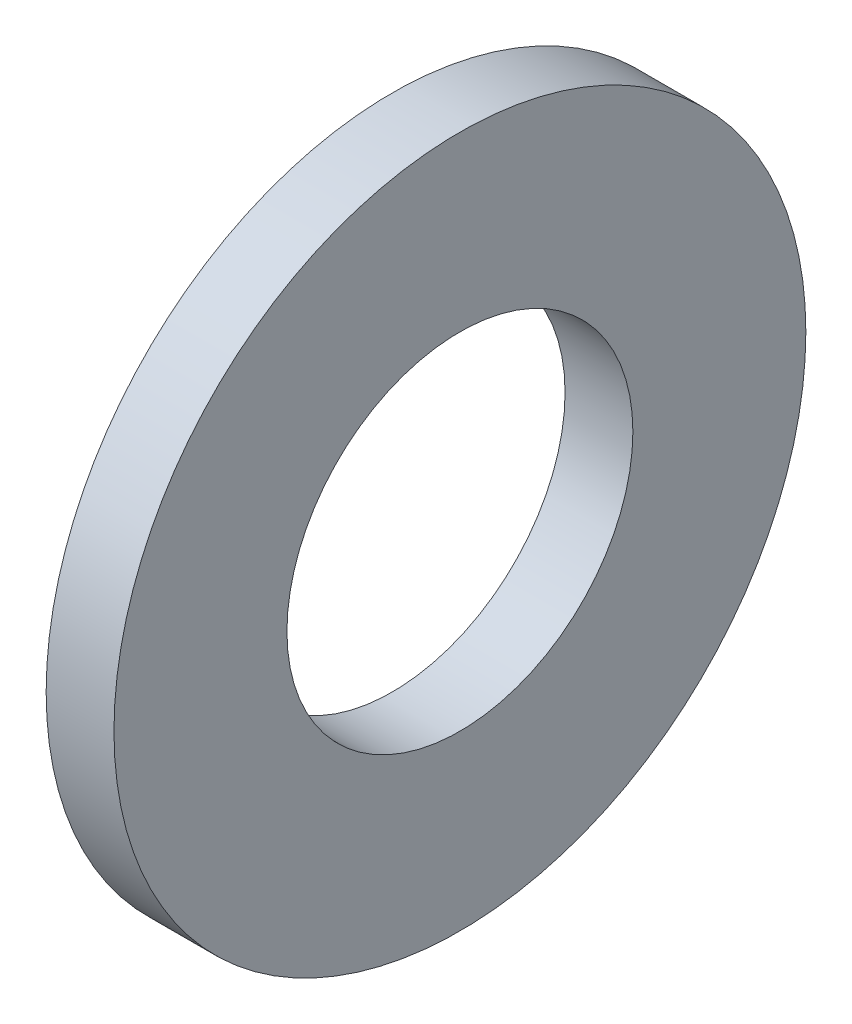
ISO-10303-21;
HEADER;
FILE_DESCRIPTION(('STEP AP214'),'2;1');
FILE_NAME('part.step','',(''),(''),'','','');
FILE_SCHEMA(('AUTOMOTIVE_DESIGN { 1 0 10303 214 1 1 1 1 }'));
ENDSEC;
DATA;
#1=APPLICATION_CONTEXT('core data for automotive mechanical design processes');
#2=APPLICATION_PROTOCOL_DEFINITION('international standard','automotive_design',2000,#1);
#3=PRODUCT_CONTEXT('',#1,'mechanical');
#4=PRODUCT('Part','Part','',(#3));
#5=PRODUCT_RELATED_PRODUCT_CATEGORY('part','',(#4));
#6=PRODUCT_DEFINITION_FORMATION('','',#4);
#7=PRODUCT_DEFINITION_CONTEXT('part definition',#1,'design');
#8=PRODUCT_DEFINITION('design','',#6,#7);
#9=PRODUCT_DEFINITION_SHAPE('','',#8);
#10=(LENGTH_UNIT() NAMED_UNIT(*) SI_UNIT(.MILLI.,.METRE.));
#11=(NAMED_UNIT(*) PLANE_ANGLE_UNIT() SI_UNIT($,.RADIAN.));
#12=(NAMED_UNIT(*) SI_UNIT($,.STERADIAN.) SOLID_ANGLE_UNIT());
#13=UNCERTAINTY_MEASURE_WITH_UNIT(LENGTH_MEASURE(1.E-05),#10,'distance_accuracy_value','');
#14=(GEOMETRIC_REPRESENTATION_CONTEXT(3) GLOBAL_UNCERTAINTY_ASSIGNED_CONTEXT((#13)) GLOBAL_UNIT_ASSIGNED_CONTEXT((#10,
#11,#12)) REPRESENTATION_CONTEXT('',''));
#15=CARTESIAN_POINT('',(0.,0.,0.));
#16=DIRECTION('',(0.,0.,1.));
#17=DIRECTION('',(1.,0.,0.));
#18=AXIS2_PLACEMENT_3D('',#15,#16,#17);
#19=CARTESIAN_POINT('',(-34.9249999999999,0.,0.));
#20=DIRECTION('',(-1.,0.,0.));
#21=DIRECTION('',(0.,0.,1.));
#22=AXIS2_PLACEMENT_3D('',#19,#20,#21);
#23=CYLINDRICAL_SURFACE('',#22,3.175);
#24=CARTESIAN_POINT('',(0.,0.,0.));
#25=DIRECTION('',(-1.,0.,0.));
#26=DIRECTION('',(0.,0.,1.));
#27=AXIS2_PLACEMENT_3D('',#24,#25,#26);
#28=CIRCLE('',#27,3.175);
#29=CARTESIAN_POINT('',(0.,0.,3.17500000000001));
#30=VERTEX_POINT('',#29);
#31=EDGE_CURVE('E12',#30,#30,#28,.T.);
#32=ORIENTED_EDGE('',*,*,#31,.F.);
#33=EDGE_LOOP('',(#32));
#34=FACE_BOUND('',#33,.T.);
#35=CARTESIAN_POINT('',(-1.24459999999998,0.,0.));
#36=DIRECTION('',(-1.,0.,0.));
#37=DIRECTION('',(0.,0.,1.));
#38=AXIS2_PLACEMENT_3D('',#35,#36,#37);
#39=CIRCLE('',#38,3.175);
#40=CARTESIAN_POINT('',(-1.24459999999998,0.,3.17500000000001));
#41=VERTEX_POINT('',#40);
#42=EDGE_CURVE('E58',#41,#41,#39,.T.);
#43=ORIENTED_EDGE('',*,*,#42,.T.);
#44=EDGE_LOOP('',(#43));
#45=FACE_BOUND('',#44,.T.);
#46=ADVANCED_FACE('F44',(#34,#45),#23,.F.);
#47=CARTESIAN_POINT('',(0.,3.17500000000001,0.));
#48=DIRECTION('',(-1.,0.,0.));
#49=DIRECTION('',(0.,0.,1.));
#50=AXIS2_PLACEMENT_3D('',#47,#48,#49);
#51=PLANE('',#50);
#52=CARTESIAN_POINT('',(0.,0.,0.));
#53=DIRECTION('',(-1.,0.,0.));
#54=DIRECTION('',(0.,0.,1.));
#55=AXIS2_PLACEMENT_3D('',#52,#53,#54);
#56=CIRCLE('',#55,6.35);
#57=CARTESIAN_POINT('',(0.,0.,6.35000000000001));
#58=VERTEX_POINT('',#57);
#59=EDGE_CURVE('E50',#58,#58,#56,.T.);
#60=ORIENTED_EDGE('',*,*,#59,.F.);
#61=EDGE_LOOP('',(#60));
#62=FACE_BOUND('',#61,.T.);
#63=ORIENTED_EDGE('',*,*,#31,.T.);
#64=EDGE_LOOP('',(#63));
#65=FACE_BOUND('',#64,.T.);
#66=ADVANCED_FACE('F73',(#62,#65),#51,.F.);
#67=CARTESIAN_POINT('',(-34.9249999999999,0.,0.));
#68=DIRECTION('',(-1.,0.,0.));
#69=DIRECTION('',(0.,0.,1.));
#70=AXIS2_PLACEMENT_3D('',#67,#68,#69);
#71=CYLINDRICAL_SURFACE('',#70,6.35);
#72=CARTESIAN_POINT('',(-1.24459999999998,0.,0.));
#73=DIRECTION('',(-1.,0.,0.));
#74=DIRECTION('',(0.,0.,1.));
#75=AXIS2_PLACEMENT_3D('',#72,#73,#74);
#76=CIRCLE('',#75,6.35);
#77=CARTESIAN_POINT('',(-1.24459999999998,0.,6.35000000000001));
#78=VERTEX_POINT('',#77);
#79=EDGE_CURVE('E54',#78,#78,#76,.T.);
#80=ORIENTED_EDGE('',*,*,#79,.F.);
#81=EDGE_LOOP('',(#80));
#82=FACE_BOUND('',#81,.T.);
#83=ORIENTED_EDGE('',*,*,#59,.T.);
#84=EDGE_LOOP('',(#83));
#85=FACE_BOUND('',#84,.T.);
#86=ADVANCED_FACE('F68',(#82,#85),#71,.T.);
#87=CARTESIAN_POINT('',(-1.24459999999998,6.34999999999999,0.));
#88=DIRECTION('',(1.,0.,0.));
#89=DIRECTION('',(0.,0.,-1.));
#90=AXIS2_PLACEMENT_3D('',#87,#88,#89);
#91=PLANE('',#90);
#92=ORIENTED_EDGE('',*,*,#42,.F.);
#93=EDGE_LOOP('',(#92));
#94=FACE_BOUND('',#93,.T.);
#95=ORIENTED_EDGE('',*,*,#79,.T.);
#96=EDGE_LOOP('',(#95));
#97=FACE_BOUND('',#96,.T.);
#98=ADVANCED_FACE('F65',(#94,#97),#91,.F.);
#99=CLOSED_SHELL('',(#46,#66,#86,#98));
#100=MANIFOLD_SOLID_BREP('B2',#99);
#101=ADVANCED_BREP_SHAPE_REPRESENTATION('',(#18,#100),#14);
#102=SHAPE_DEFINITION_REPRESENTATION(#9,#101);
ENDSEC;
END-ISO-10303-21;
